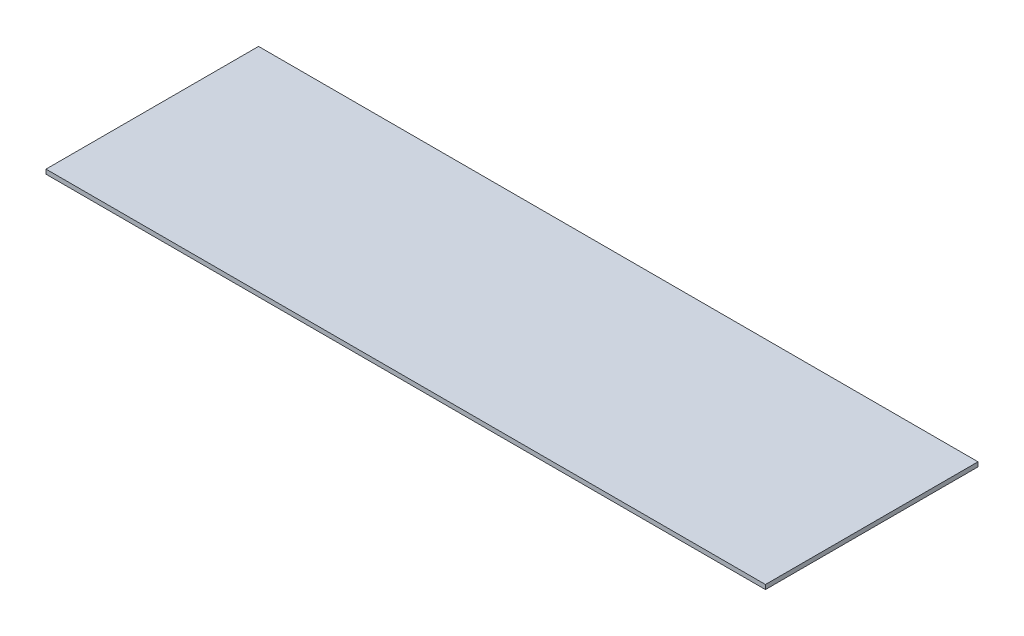
ISO-10303-21;
HEADER;
FILE_DESCRIPTION(('STEP AP214'),'2;1');
FILE_NAME('part.step','',(''),(''),'','','');
FILE_SCHEMA(('AUTOMOTIVE_DESIGN { 1 0 10303 214 1 1 1 1 }'));
ENDSEC;
DATA;
#1=APPLICATION_CONTEXT('core data for automotive mechanical design processes');
#2=APPLICATION_PROTOCOL_DEFINITION('international standard','automotive_design',2000,#1);
#3=PRODUCT_CONTEXT('',#1,'mechanical');
#4=PRODUCT('Part','Part','',(#3));
#5=PRODUCT_RELATED_PRODUCT_CATEGORY('part','',(#4));
#6=PRODUCT_DEFINITION_FORMATION('','',#4);
#7=PRODUCT_DEFINITION_CONTEXT('part definition',#1,'design');
#8=PRODUCT_DEFINITION('design','',#6,#7);
#9=PRODUCT_DEFINITION_SHAPE('','',#8);
#10=(LENGTH_UNIT() NAMED_UNIT(*) SI_UNIT(.MILLI.,.METRE.));
#11=(NAMED_UNIT(*) PLANE_ANGLE_UNIT() SI_UNIT($,.RADIAN.));
#12=(NAMED_UNIT(*) SI_UNIT($,.STERADIAN.) SOLID_ANGLE_UNIT());
#13=UNCERTAINTY_MEASURE_WITH_UNIT(LENGTH_MEASURE(1.E-05),#10,'distance_accuracy_value','');
#14=(GEOMETRIC_REPRESENTATION_CONTEXT(3) GLOBAL_UNCERTAINTY_ASSIGNED_CONTEXT((#13)) GLOBAL_UNIT_ASSIGNED_CONTEXT((#10,
#11,#12)) REPRESENTATION_CONTEXT('',''));
#15=CARTESIAN_POINT('',(0.,0.,0.));
#16=DIRECTION('',(0.,0.,1.));
#17=DIRECTION('',(1.,0.,0.));
#18=AXIS2_PLACEMENT_3D('',#15,#16,#17);
#19=CARTESIAN_POINT('',(515.874,6.35,-152.4));
#20=DIRECTION('',(-1.,0.,0.));
#21=DIRECTION('',(0.,0.,1.));
#22=AXIS2_PLACEMENT_3D('',#19,#20,#21);
#23=PLANE('',#22);
#24=DIRECTION('',(0.,0.,-1.));
#25=VECTOR('',#24,1.);
#26=CARTESIAN_POINT('',(515.874,0.,-152.4));
#27=LINE('',#26,#25);
#28=CARTESIAN_POINT('',(515.874,0.,152.4));
#29=VERTEX_POINT('',#28);
#30=CARTESIAN_POINT('',(515.874,0.,-152.4));
#31=VERTEX_POINT('',#30);
#32=EDGE_CURVE('E96',#29,#31,#27,.T.);
#33=ORIENTED_EDGE('',*,*,#32,.T.);
#34=DIRECTION('',(0.,-1.,0.));
#35=VECTOR('',#34,1.);
#36=CARTESIAN_POINT('',(515.874,6.35,-152.4));
#37=LINE('',#36,#35);
#38=CARTESIAN_POINT('',(515.874,6.35,-152.4));
#39=VERTEX_POINT('',#38);
#40=EDGE_CURVE('E11',#39,#31,#37,.T.);
#41=ORIENTED_EDGE('',*,*,#40,.F.);
#42=DIRECTION('',(0.,0.,-1.));
#43=VECTOR('',#42,1.);
#44=CARTESIAN_POINT('',(515.874,6.35,-152.4));
#45=LINE('',#44,#43);
#46=CARTESIAN_POINT('',(515.874,6.35,152.4));
#47=VERTEX_POINT('',#46);
#48=EDGE_CURVE('E84',#47,#39,#45,.T.);
#49=ORIENTED_EDGE('',*,*,#48,.F.);
#50=DIRECTION('',(0.,-1.,0.));
#51=VECTOR('',#50,1.);
#52=CARTESIAN_POINT('',(515.874,6.35,152.4));
#53=LINE('',#52,#51);
#54=EDGE_CURVE('E92',#47,#29,#53,.T.);
#55=ORIENTED_EDGE('',*,*,#54,.T.);
#56=EDGE_LOOP('',(#33,#41,#49,#55));
#57=FACE_BOUND('',#56,.T.);
#58=ADVANCED_FACE('F33',(#57),#23,.F.);
#59=CARTESIAN_POINT('',(-515.874,6.35,-152.4));
#60=DIRECTION('',(0.,0.,1.));
#61=DIRECTION('',(1.,0.,0.));
#62=AXIS2_PLACEMENT_3D('',#59,#60,#61);
#63=PLANE('',#62);
#64=DIRECTION('',(-1.,0.,0.));
#65=VECTOR('',#64,1.);
#66=CARTESIAN_POINT('',(-515.874,0.,-152.4));
#67=LINE('',#66,#65);
#68=CARTESIAN_POINT('',(-515.874,0.,-152.4));
#69=VERTEX_POINT('',#68);
#70=EDGE_CURVE('E88',#31,#69,#67,.T.);
#71=ORIENTED_EDGE('',*,*,#70,.T.);
#72=DIRECTION('',(0.,-1.,0.));
#73=VECTOR('',#72,1.);
#74=CARTESIAN_POINT('',(-515.874,6.35,-152.4));
#75=LINE('',#74,#73);
#76=CARTESIAN_POINT('',(-515.874,6.35,-152.4));
#77=VERTEX_POINT('',#76);
#78=EDGE_CURVE('E41',#77,#69,#75,.T.);
#79=ORIENTED_EDGE('',*,*,#78,.F.);
#80=DIRECTION('',(-1.,0.,0.));
#81=VECTOR('',#80,1.);
#82=CARTESIAN_POINT('',(-515.874,6.35,-152.4));
#83=LINE('',#82,#81);
#84=EDGE_CURVE('E79',#39,#77,#83,.T.);
#85=ORIENTED_EDGE('',*,*,#84,.F.);
#86=ORIENTED_EDGE('',*,*,#40,.T.);
#87=EDGE_LOOP('',(#71,#79,#85,#86));
#88=FACE_BOUND('',#87,.T.);
#89=ADVANCED_FACE('F87',(#88),#63,.F.);
#90=CARTESIAN_POINT('',(-515.874,6.35,-152.4));
#91=DIRECTION('',(1.,0.,0.));
#92=DIRECTION('',(0.,0.,-1.));
#93=AXIS2_PLACEMENT_3D('',#90,#91,#92);
#94=PLANE('',#93);
#95=DIRECTION('',(0.,0.,1.));
#96=VECTOR('',#95,1.);
#97=CARTESIAN_POINT('',(-515.874,0.,-152.4));
#98=LINE('',#97,#96);
#99=CARTESIAN_POINT('',(-515.874,0.,152.4));
#100=VERTEX_POINT('',#99);
#101=EDGE_CURVE('E66',#69,#100,#98,.T.);
#102=ORIENTED_EDGE('',*,*,#101,.T.);
#103=DIRECTION('',(0.,-1.,0.));
#104=VECTOR('',#103,1.);
#105=CARTESIAN_POINT('',(-515.874,6.35,152.4));
#106=LINE('',#105,#104);
#107=CARTESIAN_POINT('',(-515.874,6.35,152.4));
#108=VERTEX_POINT('',#107);
#109=EDGE_CURVE('E89',#108,#100,#106,.T.);
#110=ORIENTED_EDGE('',*,*,#109,.F.);
#111=DIRECTION('',(0.,0.,1.));
#112=VECTOR('',#111,1.);
#113=CARTESIAN_POINT('',(-515.874,6.35,-152.4));
#114=LINE('',#113,#112);
#115=EDGE_CURVE('E82',#77,#108,#114,.T.);
#116=ORIENTED_EDGE('',*,*,#115,.F.);
#117=ORIENTED_EDGE('',*,*,#78,.T.);
#118=EDGE_LOOP('',(#102,#110,#116,#117));
#119=FACE_BOUND('',#118,.T.);
#120=ADVANCED_FACE('F90',(#119),#94,.F.);
#121=CARTESIAN_POINT('',(-515.874,6.35,152.4));
#122=DIRECTION('',(0.,0.,-1.));
#123=DIRECTION('',(-1.,0.,0.));
#124=AXIS2_PLACEMENT_3D('',#121,#122,#123);
#125=PLANE('',#124);
#126=DIRECTION('',(1.,0.,0.));
#127=VECTOR('',#126,1.);
#128=CARTESIAN_POINT('',(-515.874,0.,152.4));
#129=LINE('',#128,#127);
#130=EDGE_CURVE('E72',#100,#29,#129,.T.);
#131=ORIENTED_EDGE('',*,*,#130,.T.);
#132=ORIENTED_EDGE('',*,*,#54,.F.);
#133=DIRECTION('',(1.,0.,0.));
#134=VECTOR('',#133,1.);
#135=CARTESIAN_POINT('',(-515.874,6.35,152.4));
#136=LINE('',#135,#134);
#137=EDGE_CURVE('E49',#108,#47,#136,.T.);
#138=ORIENTED_EDGE('',*,*,#137,.F.);
#139=ORIENTED_EDGE('',*,*,#109,.T.);
#140=EDGE_LOOP('',(#131,#132,#138,#139));
#141=FACE_BOUND('',#140,.T.);
#142=ADVANCED_FACE('F103',(#141),#125,.F.);
#143=CARTESIAN_POINT('',(0.,6.35,0.));
#144=DIRECTION('',(0.,1.,0.));
#145=DIRECTION('',(0.,0.,1.));
#146=AXIS2_PLACEMENT_3D('',#143,#144,#145);
#147=PLANE('',#146);
#148=ORIENTED_EDGE('',*,*,#48,.T.);
#149=ORIENTED_EDGE('',*,*,#84,.T.);
#150=ORIENTED_EDGE('',*,*,#115,.T.);
#151=ORIENTED_EDGE('',*,*,#137,.T.);
#152=EDGE_LOOP('',(#148,#149,#150,#151));
#153=FACE_BOUND('',#152,.T.);
#154=ADVANCED_FACE('F80',(#153),#147,.T.);
#155=CARTESIAN_POINT('',(0.,0.,0.));
#156=DIRECTION('',(0.,1.,0.));
#157=DIRECTION('',(0.,0.,1.));
#158=AXIS2_PLACEMENT_3D('',#155,#156,#157);
#159=PLANE('',#158);
#160=ORIENTED_EDGE('',*,*,#32,.F.);
#161=ORIENTED_EDGE('',*,*,#130,.F.);
#162=ORIENTED_EDGE('',*,*,#101,.F.);
#163=ORIENTED_EDGE('',*,*,#70,.F.);
#164=EDGE_LOOP('',(#160,#161,#162,#163));
#165=FACE_BOUND('',#164,.T.);
#166=ADVANCED_FACE('F106',(#165),#159,.F.);
#167=CLOSED_SHELL('',(#58,#89,#120,#142,#154,#166));
#168=MANIFOLD_SOLID_BREP('B2',#167);
#169=ADVANCED_BREP_SHAPE_REPRESENTATION('',(#18,#168),#14);
#170=SHAPE_DEFINITION_REPRESENTATION(#9,#169);
ENDSEC;
END-ISO-10303-21;
